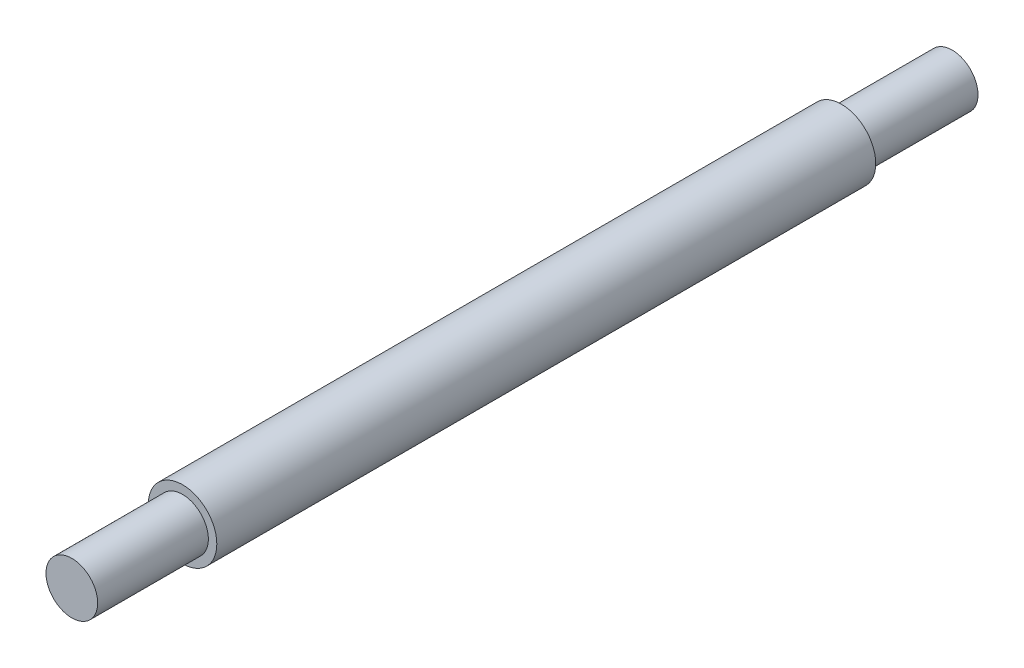
ISO-10303-21;
HEADER;
FILE_DESCRIPTION(('STEP AP214'),'2;1');
FILE_NAME('part.step','',(''),(''),'','','');
FILE_SCHEMA(('AUTOMOTIVE_DESIGN { 1 0 10303 214 1 1 1 1 }'));
ENDSEC;
DATA;
#1=APPLICATION_CONTEXT('core data for automotive mechanical design processes');
#2=APPLICATION_PROTOCOL_DEFINITION('international standard','automotive_design',2000,#1);
#3=PRODUCT_CONTEXT('',#1,'mechanical');
#4=PRODUCT('Part','Part','',(#3));
#5=PRODUCT_RELATED_PRODUCT_CATEGORY('part','',(#4));
#6=PRODUCT_DEFINITION_FORMATION('','',#4);
#7=PRODUCT_DEFINITION_CONTEXT('part definition',#1,'design');
#8=PRODUCT_DEFINITION('design','',#6,#7);
#9=PRODUCT_DEFINITION_SHAPE('','',#8);
#10=(LENGTH_UNIT() NAMED_UNIT(*) SI_UNIT(.MILLI.,.METRE.));
#11=(NAMED_UNIT(*) PLANE_ANGLE_UNIT() SI_UNIT($,.RADIAN.));
#12=(NAMED_UNIT(*) SI_UNIT($,.STERADIAN.) SOLID_ANGLE_UNIT());
#13=UNCERTAINTY_MEASURE_WITH_UNIT(LENGTH_MEASURE(1.E-05),#10,'distance_accuracy_value','');
#14=(GEOMETRIC_REPRESENTATION_CONTEXT(3) GLOBAL_UNCERTAINTY_ASSIGNED_CONTEXT((#13)) GLOBAL_UNIT_ASSIGNED_CONTEXT((#10,
#11,#12)) REPRESENTATION_CONTEXT('',''));
#15=CARTESIAN_POINT('',(0.,0.,0.));
#16=DIRECTION('',(0.,0.,1.));
#17=DIRECTION('',(1.,0.,0.));
#18=AXIS2_PLACEMENT_3D('',#15,#16,#17);
#19=CARTESIAN_POINT('',(0.,0.,125.));
#20=DIRECTION('',(0.,0.,-1.));
#21=DIRECTION('',(-1.,0.,0.));
#22=AXIS2_PLACEMENT_3D('',#19,#20,#21);
#23=CYLINDRICAL_SURFACE('',#22,6.5);
#24=CARTESIAN_POINT('',(0.,0.,125.));
#25=DIRECTION('',(0.,0.,1.));
#26=DIRECTION('',(1.,0.,0.));
#27=AXIS2_PLACEMENT_3D('',#24,#25,#26);
#28=CIRCLE('',#27,6.5);
#29=CARTESIAN_POINT('',(6.5,0.,125.));
#30=VERTEX_POINT('',#29);
#31=EDGE_CURVE('E51',#30,#30,#28,.T.);
#32=ORIENTED_EDGE('',*,*,#31,.F.);
#33=EDGE_LOOP('',(#32));
#34=FACE_BOUND('',#33,.T.);
#35=CARTESIAN_POINT('',(0.,0.,0.));
#36=DIRECTION('',(0.,0.,1.));
#37=DIRECTION('',(1.,0.,0.));
#38=AXIS2_PLACEMENT_3D('',#35,#36,#37);
#39=CIRCLE('',#38,6.5);
#40=CARTESIAN_POINT('',(6.5,0.,0.));
#41=VERTEX_POINT('',#40);
#42=EDGE_CURVE('E42',#41,#41,#39,.T.);
#43=ORIENTED_EDGE('',*,*,#42,.T.);
#44=EDGE_LOOP('',(#43));
#45=FACE_BOUND('',#44,.T.);
#46=ADVANCED_FACE('F39',(#34,#45),#23,.T.);
#47=CARTESIAN_POINT('',(0.,0.,125.));
#48=DIRECTION('',(0.,0.,1.));
#49=DIRECTION('',(1.,0.,0.));
#50=AXIS2_PLACEMENT_3D('',#47,#48,#49);
#51=PLANE('',#50);
#52=CARTESIAN_POINT('',(0.,0.,125.));
#53=DIRECTION('',(0.,0.,1.));
#54=DIRECTION('',(1.,0.,0.));
#55=AXIS2_PLACEMENT_3D('',#52,#53,#54);
#56=CIRCLE('',#55,4.9);
#57=CARTESIAN_POINT('',(-4.9,0.,125.));
#58=VERTEX_POINT('',#57);
#59=EDGE_CURVE('E46',#58,#58,#56,.T.);
#60=ORIENTED_EDGE('',*,*,#59,.F.);
#61=EDGE_LOOP('',(#60));
#62=FACE_BOUND('',#61,.T.);
#63=ORIENTED_EDGE('',*,*,#31,.T.);
#64=EDGE_LOOP('',(#63));
#65=FACE_BOUND('',#64,.T.);
#66=ADVANCED_FACE('F68',(#62,#65),#51,.T.);
#67=CARTESIAN_POINT('',(0.,0.,0.));
#68=DIRECTION('',(0.,0.,1.));
#69=DIRECTION('',(1.,0.,0.));
#70=AXIS2_PLACEMENT_3D('',#67,#68,#69);
#71=PLANE('',#70);
#72=CARTESIAN_POINT('',(0.,0.,0.));
#73=DIRECTION('',(0.,0.,-1.));
#74=DIRECTION('',(-1.,0.,0.));
#75=AXIS2_PLACEMENT_3D('',#72,#73,#74);
#76=CIRCLE('',#75,4.9);
#77=CARTESIAN_POINT('',(4.9,0.,0.));
#78=VERTEX_POINT('',#77);
#79=EDGE_CURVE('E10',#78,#78,#76,.T.);
#80=ORIENTED_EDGE('',*,*,#79,.F.);
#81=EDGE_LOOP('',(#80));
#82=FACE_BOUND('',#81,.T.);
#83=ORIENTED_EDGE('',*,*,#42,.F.);
#84=EDGE_LOOP('',(#83));
#85=FACE_BOUND('',#84,.T.);
#86=ADVANCED_FACE('F65',(#82,#85),#71,.F.);
#87=CARTESIAN_POINT('',(0.,0.,146.));
#88=DIRECTION('',(0.,0.,-1.));
#89=DIRECTION('',(-1.,0.,0.));
#90=AXIS2_PLACEMENT_3D('',#87,#88,#89);
#91=CYLINDRICAL_SURFACE('',#90,4.9);
#92=CARTESIAN_POINT('',(0.,0.,146.));
#93=DIRECTION('',(0.,0.,1.));
#94=DIRECTION('',(1.,0.,0.));
#95=AXIS2_PLACEMENT_3D('',#92,#93,#94);
#96=CIRCLE('',#95,4.9);
#97=CARTESIAN_POINT('',(-4.9,0.,146.));
#98=VERTEX_POINT('',#97);
#99=EDGE_CURVE('E56',#98,#98,#96,.T.);
#100=CARTESIAN_POINT('',(-4.9,0.,146.));
#101=CARTESIAN_POINT('',(-4.9,0.,145.78125));
#102=CARTESIAN_POINT('',(-4.9,0.,145.5625));
#103=CARTESIAN_POINT('',(-4.9,0.,145.125));
#104=CARTESIAN_POINT('',(-4.9,0.,144.90625));
#105=CARTESIAN_POINT('',(-4.9,0.,144.46875));
#106=CARTESIAN_POINT('',(-4.9,0.,144.25));
#107=CARTESIAN_POINT('',(-4.9,0.,143.8125));
#108=CARTESIAN_POINT('',(-4.9,0.,143.59375));
#109=CARTESIAN_POINT('',(-4.9,0.,143.15625));
#110=CARTESIAN_POINT('',(-4.9,0.,142.9375));
#111=CARTESIAN_POINT('',(-4.9,0.,142.5));
#112=CARTESIAN_POINT('',(-4.9,0.,142.28125));
#113=CARTESIAN_POINT('',(-4.9,0.,141.84375));
#114=CARTESIAN_POINT('',(-4.9,0.,141.625));
#115=CARTESIAN_POINT('',(-4.9,0.,141.1875));
#116=CARTESIAN_POINT('',(-4.9,0.,140.96875));
#117=CARTESIAN_POINT('',(-4.9,0.,140.53125));
#118=CARTESIAN_POINT('',(-4.9,0.,140.3125));
#119=CARTESIAN_POINT('',(-4.9,0.,139.875));
#120=CARTESIAN_POINT('',(-4.9,0.,139.65625));
#121=CARTESIAN_POINT('',(-4.9,0.,139.21875));
#122=CARTESIAN_POINT('',(-4.9,0.,139.));
#123=CARTESIAN_POINT('',(-4.9,0.,138.5625));
#124=CARTESIAN_POINT('',(-4.9,0.,138.34375));
#125=CARTESIAN_POINT('',(-4.9,0.,137.90625));
#126=CARTESIAN_POINT('',(-4.9,0.,137.6875));
#127=CARTESIAN_POINT('',(-4.9,0.,137.25));
#128=CARTESIAN_POINT('',(-4.9,0.,137.03125));
#129=CARTESIAN_POINT('',(-4.9,0.,136.59375));
#130=CARTESIAN_POINT('',(-4.9,0.,136.375));
#131=CARTESIAN_POINT('',(-4.9,0.,135.9375));
#132=CARTESIAN_POINT('',(-4.9,0.,135.71875));
#133=CARTESIAN_POINT('',(-4.9,0.,135.28125));
#134=CARTESIAN_POINT('',(-4.9,0.,135.0625));
#135=CARTESIAN_POINT('',(-4.9,0.,134.625));
#136=CARTESIAN_POINT('',(-4.9,0.,134.40625));
#137=CARTESIAN_POINT('',(-4.9,0.,133.96875));
#138=CARTESIAN_POINT('',(-4.9,0.,133.75));
#139=CARTESIAN_POINT('',(-4.9,0.,133.3125));
#140=CARTESIAN_POINT('',(-4.9,0.,133.09375));
#141=CARTESIAN_POINT('',(-4.9,0.,132.65625));
#142=CARTESIAN_POINT('',(-4.9,0.,132.4375));
#143=CARTESIAN_POINT('',(-4.9,0.,132.));
#144=CARTESIAN_POINT('',(-4.9,0.,131.78125));
#145=CARTESIAN_POINT('',(-4.9,0.,131.34375));
#146=CARTESIAN_POINT('',(-4.9,0.,131.125));
#147=CARTESIAN_POINT('',(-4.9,0.,130.6875));
#148=CARTESIAN_POINT('',(-4.9,0.,130.46875));
#149=CARTESIAN_POINT('',(-4.9,0.,130.03125));
#150=CARTESIAN_POINT('',(-4.9,0.,129.8125));
#151=CARTESIAN_POINT('',(-4.9,0.,129.375));
#152=CARTESIAN_POINT('',(-4.9,0.,129.15625));
#153=CARTESIAN_POINT('',(-4.9,0.,128.71875));
#154=CARTESIAN_POINT('',(-4.9,0.,128.5));
#155=CARTESIAN_POINT('',(-4.9,0.,128.0625));
#156=CARTESIAN_POINT('',(-4.9,0.,127.84375));
#157=CARTESIAN_POINT('',(-4.9,0.,127.40625));
#158=CARTESIAN_POINT('',(-4.9,0.,127.1875));
#159=CARTESIAN_POINT('',(-4.9,0.,126.75));
#160=CARTESIAN_POINT('',(-4.9,0.,126.53125));
#161=CARTESIAN_POINT('',(-4.9,0.,126.09375));
#162=CARTESIAN_POINT('',(-4.9,0.,125.875));
#163=CARTESIAN_POINT('',(-4.9,0.,125.4375));
#164=CARTESIAN_POINT('',(-4.9,0.,125.21875));
#165=CARTESIAN_POINT('',(-4.9,0.,125.));
#166=B_SPLINE_CURVE_WITH_KNOTS('',3,(#100,#101,#102,#103,#104,#105,#106,#107,#108,#109,#110,
#111,#112,#113,#114,#115,#116,#117,#118,#119,#120,#121,#122,#123,#124,#125,#126,#127,#128,#129,
#130,#131,#132,#133,#134,#135,#136,#137,#138,#139,#140,#141,#142,#143,#144,#145,#146,#147,#148,
#149,#150,#151,#152,#153,#154,#155,#156,#157,#158,#159,#160,#161,#162,#163,#164,#165),
.UNSPECIFIED.,.F.,.F.,(4,2,2,2,2,2,2,2,2,2,2,2,2,2,2,2,2,2,2,2,2,2,2,2,2,2,2,2,2,2,2,2,4),(0.,
0.656249999999997,1.31249999999999,1.96874999999999,2.62499999999999,3.28124999999999,
3.93749999999998,4.59374999999998,5.24999999999998,5.90624999999997,6.56249999999997,7.21875,
7.87499999999999,8.53124999999999,9.18749999999999,9.84374999999998,10.5,11.15625,11.8125,
12.46875,13.125,13.78125,14.4375,15.09375,15.75,16.40625,17.0625,17.71875,18.375,19.03125,
19.6875,20.34375,21.),.UNSPECIFIED.);
#167=EDGE_CURVE('BSEAM67',#98,#58,#166,.T.);
#168=ORIENTED_EDGE('',*,*,#99,.F.);
#169=ORIENTED_EDGE('',*,*,#59,.T.);
#170=ORIENTED_EDGE('',*,*,#167,.T.);
#171=ORIENTED_EDGE('',*,*,#167,.F.);
#172=EDGE_LOOP('',(#168,#170,#169,#171));
#173=FACE_BOUND('',#172,.T.);
#174=ADVANCED_FACE('F67',(#173),#91,.T.);
#175=CARTESIAN_POINT('',(0.,0.,146.));
#176=DIRECTION('',(0.,0.,1.));
#177=DIRECTION('',(1.,0.,0.));
#178=AXIS2_PLACEMENT_3D('',#175,#176,#177);
#179=PLANE('',#178);
#180=ORIENTED_EDGE('',*,*,#99,.T.);
#181=EDGE_LOOP('',(#180));
#182=FACE_BOUND('',#181,.T.);
#183=ADVANCED_FACE('F75',(#182),#179,.T.);
#184=CARTESIAN_POINT('',(0.,0.,-21.));
#185=DIRECTION('',(0.,0.,1.));
#186=DIRECTION('',(1.,0.,0.));
#187=AXIS2_PLACEMENT_3D('',#184,#185,#186);
#188=CYLINDRICAL_SURFACE('',#187,4.9);
#189=CARTESIAN_POINT('',(0.,0.,-21.));
#190=DIRECTION('',(0.,0.,-1.));
#191=DIRECTION('',(-1.,0.,0.));
#192=AXIS2_PLACEMENT_3D('',#189,#190,#191);
#193=CIRCLE('',#192,4.9);
#194=CARTESIAN_POINT('',(4.9,0.,-21.));
#195=VERTEX_POINT('',#194);
#196=EDGE_CURVE('E55',#195,#195,#193,.T.);
#197=CARTESIAN_POINT('',(4.9,0.,-21.));
#198=CARTESIAN_POINT('',(4.9,0.,-20.78125));
#199=CARTESIAN_POINT('',(4.9,0.,-20.5625));
#200=CARTESIAN_POINT('',(4.9,0.,-20.125));
#201=CARTESIAN_POINT('',(4.9,0.,-19.90625));
#202=CARTESIAN_POINT('',(4.9,0.,-19.46875));
#203=CARTESIAN_POINT('',(4.9,0.,-19.25));
#204=CARTESIAN_POINT('',(4.9,0.,-18.8125));
#205=CARTESIAN_POINT('',(4.9,0.,-18.59375));
#206=CARTESIAN_POINT('',(4.9,0.,-18.15625));
#207=CARTESIAN_POINT('',(4.9,0.,-17.9375));
#208=CARTESIAN_POINT('',(4.9,0.,-17.5));
#209=CARTESIAN_POINT('',(4.9,0.,-17.28125));
#210=CARTESIAN_POINT('',(4.9,0.,-16.84375));
#211=CARTESIAN_POINT('',(4.9,0.,-16.625));
#212=CARTESIAN_POINT('',(4.9,0.,-16.1875));
#213=CARTESIAN_POINT('',(4.9,0.,-15.96875));
#214=CARTESIAN_POINT('',(4.9,0.,-15.53125));
#215=CARTESIAN_POINT('',(4.9,0.,-15.3125));
#216=CARTESIAN_POINT('',(4.9,0.,-14.875));
#217=CARTESIAN_POINT('',(4.9,0.,-14.65625));
#218=CARTESIAN_POINT('',(4.9,0.,-14.21875));
#219=CARTESIAN_POINT('',(4.9,0.,-14.));
#220=CARTESIAN_POINT('',(4.9,0.,-13.5625));
#221=CARTESIAN_POINT('',(4.9,0.,-13.34375));
#222=CARTESIAN_POINT('',(4.9,0.,-12.90625));
#223=CARTESIAN_POINT('',(4.9,0.,-12.6875));
#224=CARTESIAN_POINT('',(4.9,0.,-12.25));
#225=CARTESIAN_POINT('',(4.9,0.,-12.03125));
#226=CARTESIAN_POINT('',(4.9,0.,-11.59375));
#227=CARTESIAN_POINT('',(4.9,0.,-11.375));
#228=CARTESIAN_POINT('',(4.9,0.,-10.9375));
#229=CARTESIAN_POINT('',(4.9,0.,-10.71875));
#230=CARTESIAN_POINT('',(4.9,0.,-10.28125));
#231=CARTESIAN_POINT('',(4.9,0.,-10.0625));
#232=CARTESIAN_POINT('',(4.9,0.,-9.625));
#233=CARTESIAN_POINT('',(4.9,0.,-9.40625));
#234=CARTESIAN_POINT('',(4.9,0.,-8.96875));
#235=CARTESIAN_POINT('',(4.9,0.,-8.75));
#236=CARTESIAN_POINT('',(4.9,0.,-8.3125));
#237=CARTESIAN_POINT('',(4.9,0.,-8.09375));
#238=CARTESIAN_POINT('',(4.9,0.,-7.65625));
#239=CARTESIAN_POINT('',(4.9,0.,-7.4375));
#240=CARTESIAN_POINT('',(4.9,0.,-7.));
#241=CARTESIAN_POINT('',(4.9,0.,-6.78125));
#242=CARTESIAN_POINT('',(4.9,0.,-6.34375));
#243=CARTESIAN_POINT('',(4.9,0.,-6.125));
#244=CARTESIAN_POINT('',(4.9,0.,-5.6875));
#245=CARTESIAN_POINT('',(4.9,0.,-5.46875));
#246=CARTESIAN_POINT('',(4.9,0.,-5.03125));
#247=CARTESIAN_POINT('',(4.9,0.,-4.8125));
#248=CARTESIAN_POINT('',(4.9,0.,-4.375));
#249=CARTESIAN_POINT('',(4.9,0.,-4.15625));
#250=CARTESIAN_POINT('',(4.9,0.,-3.71875));
#251=CARTESIAN_POINT('',(4.9,0.,-3.5));
#252=CARTESIAN_POINT('',(4.9,0.,-3.0625));
#253=CARTESIAN_POINT('',(4.9,0.,-2.84375));
#254=CARTESIAN_POINT('',(4.9,0.,-2.40625));
#255=CARTESIAN_POINT('',(4.9,0.,-2.1875));
#256=CARTESIAN_POINT('',(4.9,0.,-1.75));
#257=CARTESIAN_POINT('',(4.9,0.,-1.53125));
#258=CARTESIAN_POINT('',(4.9,0.,-1.09375));
#259=CARTESIAN_POINT('',(4.9,0.,-0.875000000000001));
#260=CARTESIAN_POINT('',(4.9,0.,-0.4375));
#261=CARTESIAN_POINT('',(4.9,0.,-0.21875));
#262=CARTESIAN_POINT('',(4.9,0.,0.));
#263=B_SPLINE_CURVE_WITH_KNOTS('',3,(#197,#198,#199,#200,#201,#202,#203,#204,#205,#206,#207,
#208,#209,#210,#211,#212,#213,#214,#215,#216,#217,#218,#219,#220,#221,#222,#223,#224,#225,#226,
#227,#228,#229,#230,#231,#232,#233,#234,#235,#236,#237,#238,#239,#240,#241,#242,#243,#244,#245,
#246,#247,#248,#249,#250,#251,#252,#253,#254,#255,#256,#257,#258,#259,#260,#261,#262),
.UNSPECIFIED.,.F.,.F.,(4,2,2,2,2,2,2,2,2,2,2,2,2,2,2,2,2,2,2,2,2,2,2,2,2,2,2,2,2,2,2,2,4),(0.,
0.656250000000001,1.3125,1.96875,2.625,3.28125,3.9375,4.59375,5.25,5.90625,6.5625,7.21875,7.875,
8.53125,9.1875,9.84375,10.5,11.15625,11.8125,12.46875,13.125,13.78125,14.4375,15.09375,15.75,
16.40625,17.0625,17.71875,18.375,19.03125,19.6875,20.34375,21.),.UNSPECIFIED.);
#264=EDGE_CURVE('BSEAM100',#195,#78,#263,.T.);
#265=ORIENTED_EDGE('',*,*,#196,.F.);
#266=ORIENTED_EDGE('',*,*,#79,.T.);
#267=ORIENTED_EDGE('',*,*,#264,.T.);
#268=ORIENTED_EDGE('',*,*,#264,.F.);
#269=EDGE_LOOP('',(#265,#267,#266,#268));
#270=FACE_BOUND('',#269,.T.);
#271=ADVANCED_FACE('F100',(#270),#188,.T.);
#272=CARTESIAN_POINT('',(0.,0.,-21.));
#273=DIRECTION('',(0.,0.,-1.));
#274=DIRECTION('',(-1.,0.,0.));
#275=AXIS2_PLACEMENT_3D('',#272,#273,#274);
#276=PLANE('',#275);
#277=ORIENTED_EDGE('',*,*,#196,.T.);
#278=EDGE_LOOP('',(#277));
#279=FACE_BOUND('',#278,.T.);
#280=ADVANCED_FACE('F112',(#279),#276,.T.);
#281=CLOSED_SHELL('',(#46,#66,#86,#174,#183,#271,#280));
#282=MANIFOLD_SOLID_BREP('B2',#281);
#283=ADVANCED_BREP_SHAPE_REPRESENTATION('',(#18,#282),#14);
#284=SHAPE_DEFINITION_REPRESENTATION(#9,#283);
ENDSEC;
END-ISO-10303-21;
